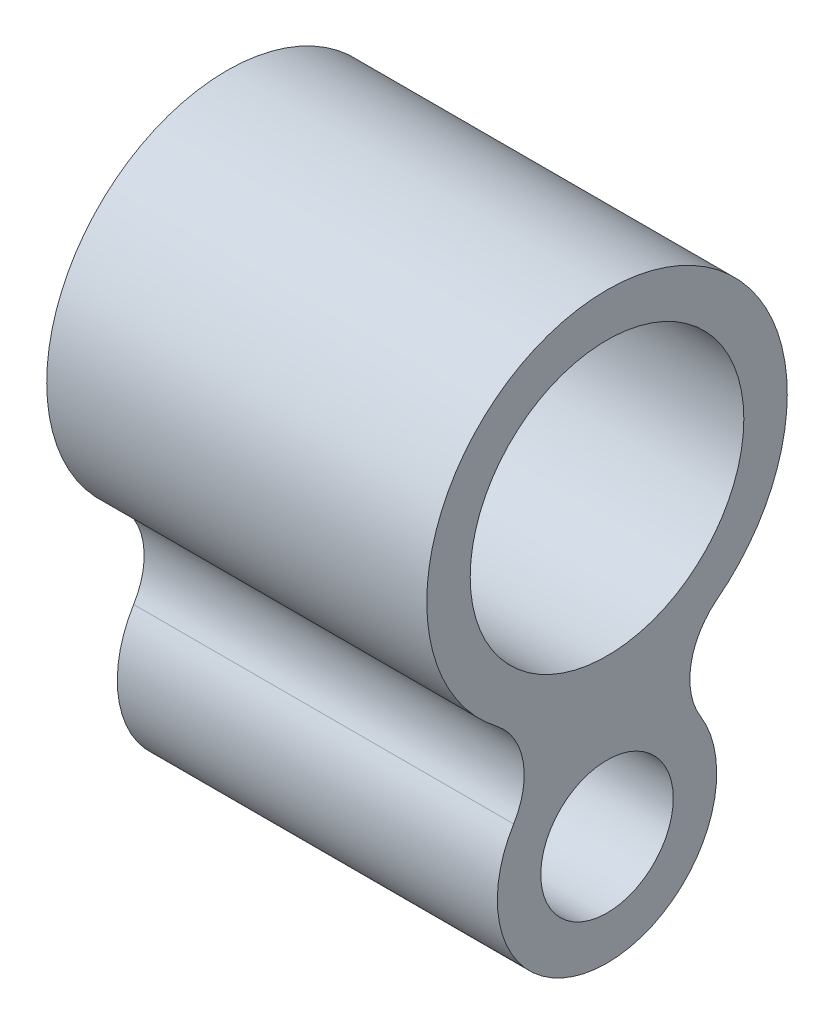
ISO-10303-21;
HEADER;
FILE_DESCRIPTION(('STEP AP214'),'2;1');
FILE_NAME('part.step','',(''),(''),'','','');
FILE_SCHEMA(('AUTOMOTIVE_DESIGN { 1 0 10303 214 1 1 1 1 }'));
ENDSEC;
DATA;
#1=APPLICATION_CONTEXT('core data for automotive mechanical design processes');
#2=APPLICATION_PROTOCOL_DEFINITION('international standard','automotive_design',2000,#1);
#3=PRODUCT_CONTEXT('',#1,'mechanical');
#4=PRODUCT('Part','Part','',(#3));
#5=PRODUCT_RELATED_PRODUCT_CATEGORY('part','',(#4));
#6=PRODUCT_DEFINITION_FORMATION('','',#4);
#7=PRODUCT_DEFINITION_CONTEXT('part definition',#1,'design');
#8=PRODUCT_DEFINITION('design','',#6,#7);
#9=PRODUCT_DEFINITION_SHAPE('','',#8);
#10=(LENGTH_UNIT() NAMED_UNIT(*) SI_UNIT(.MILLI.,.METRE.));
#11=(NAMED_UNIT(*) PLANE_ANGLE_UNIT() SI_UNIT($,.RADIAN.));
#12=(NAMED_UNIT(*) SI_UNIT($,.STERADIAN.) SOLID_ANGLE_UNIT());
#13=UNCERTAINTY_MEASURE_WITH_UNIT(LENGTH_MEASURE(1.E-05),#10,'distance_accuracy_value','');
#14=(GEOMETRIC_REPRESENTATION_CONTEXT(3) GLOBAL_UNCERTAINTY_ASSIGNED_CONTEXT((#13)) GLOBAL_UNIT_ASSIGNED_CONTEXT((#10,
#11,#12)) REPRESENTATION_CONTEXT('',''));
#15=CARTESIAN_POINT('',(0.,0.,0.));
#16=DIRECTION('',(0.,0.,1.));
#17=DIRECTION('',(1.,0.,0.));
#18=AXIS2_PLACEMENT_3D('',#15,#16,#17);
#19=CARTESIAN_POINT('',(35.,-27.,0.));
#20=DIRECTION('',(1.,0.,0.));
#21=DIRECTION('',(0.,0.,-1.));
#22=AXIS2_PLACEMENT_3D('',#19,#20,#21);
#23=PLANE('',#22);
#24=CARTESIAN_POINT('',(35.,-27.,0.));
#25=DIRECTION('',(1.,0.,0.));
#26=DIRECTION('',(0.,0.,-1.));
#27=AXIS2_PLACEMENT_3D('',#24,#25,#26);
#28=CIRCLE('',#27,10.1);
#29=CARTESIAN_POINT('',(35.,-21.6967725213764,8.59568370229917));
#30=VERTEX_POINT('',#29);
#31=CARTESIAN_POINT('',(35.,-21.6967725213764,-8.59568370229918));
#32=VERTEX_POINT('',#31);
#33=EDGE_CURVE('E138',#30,#32,#28,.T.);
#34=ORIENTED_EDGE('',*,*,#33,.T.);
#35=CARTESIAN_POINT('',(35.,-18.2803071393056,-14.1332277587267));
#36=DIRECTION('',(1.,0.,0.));
#37=DIRECTION('',(0.,0.,-1.));
#38=AXIS2_PLACEMENT_3D('',#35,#36,#37);
#39=CIRCLE('',#38,6.50666042480805);
#40=CARTESIAN_POINT('',(35.,-13.1744571875346,-10.1));
#41=VERTEX_POINT('',#40);
#42=EDGE_CURVE('E112',#41,#32,#39,.T.);
#43=ORIENTED_EDGE('',*,*,#42,.F.);
#44=DIRECTION('',(0.,1.,0.));
#45=VECTOR('',#44,1.);
#46=CARTESIAN_POINT('',(35.,-27.,-10.1));
#47=LINE('',#46,#45);
#48=CARTESIAN_POINT('',(35.,-13.1738377096425,-10.1));
#49=VERTEX_POINT('',#48);
#50=EDGE_CURVE('E137',#41,#49,#47,.T.);
#51=ORIENTED_EDGE('',*,*,#50,.T.);
#52=CARTESIAN_POINT('',(35.,0.,0.));
#53=DIRECTION('',(1.,0.,0.));
#54=DIRECTION('',(0.,0.,-1.));
#55=AXIS2_PLACEMENT_3D('',#52,#53,#54);
#56=CIRCLE('',#55,16.6);
#57=CARTESIAN_POINT('',(35.,-13.1738377096425,10.1));
#58=VERTEX_POINT('',#57);
#59=EDGE_CURVE('E39',#49,#58,#56,.T.);
#60=ORIENTED_EDGE('',*,*,#59,.T.);
#61=DIRECTION('',(0.,-1.,0.));
#62=VECTOR('',#61,1.);
#63=CARTESIAN_POINT('',(35.,-27.,10.1));
#64=LINE('',#63,#62);
#65=CARTESIAN_POINT('',(35.,-13.1744571875346,10.1));
#66=VERTEX_POINT('',#65);
#67=EDGE_CURVE('E141',#58,#66,#64,.T.);
#68=ORIENTED_EDGE('',*,*,#67,.T.);
#69=CARTESIAN_POINT('',(35.,-18.2803071393056,14.1332277587267));
#70=DIRECTION('',(1.,0.,0.));
#71=DIRECTION('',(0.,0.,-1.));
#72=AXIS2_PLACEMENT_3D('',#69,#70,#71);
#73=CIRCLE('',#72,6.50666042480806);
#74=EDGE_CURVE('E74',#30,#66,#73,.T.);
#75=ORIENTED_EDGE('',*,*,#74,.F.);
#76=EDGE_LOOP('',(#34,#43,#51,#60,#68,#75));
#77=FACE_BOUND('',#76,.T.);
#78=CARTESIAN_POINT('',(35.,0.,0.));
#79=DIRECTION('',(1.,0.,0.));
#80=DIRECTION('',(0.,0.,-1.));
#81=AXIS2_PLACEMENT_3D('',#78,#79,#80);
#82=CIRCLE('',#81,12.6);
#83=CARTESIAN_POINT('',(35.,0.,-12.6));
#84=VERTEX_POINT('',#83);
#85=EDGE_CURVE('E105',#84,#84,#82,.T.);
#86=ORIENTED_EDGE('',*,*,#85,.F.);
#87=EDGE_LOOP('',(#86));
#88=FACE_BOUND('',#87,.T.);
#89=CARTESIAN_POINT('',(35.,-27.,0.));
#90=DIRECTION('',(1.,0.,0.));
#91=DIRECTION('',(0.,0.,-1.));
#92=AXIS2_PLACEMENT_3D('',#89,#90,#91);
#93=CIRCLE('',#92,6.1);
#94=CARTESIAN_POINT('',(35.,-27.,-6.1));
#95=VERTEX_POINT('',#94);
#96=EDGE_CURVE('E127',#95,#95,#93,.T.);
#97=ORIENTED_EDGE('',*,*,#96,.F.);
#98=EDGE_LOOP('',(#97));
#99=FACE_BOUND('',#98,.T.);
#100=ADVANCED_FACE('F35',(#77,#88,#99),#23,.T.);
#101=CARTESIAN_POINT('',(0.,-27.,0.));
#102=DIRECTION('',(1.,0.,0.));
#103=DIRECTION('',(0.,0.,-1.));
#104=AXIS2_PLACEMENT_3D('',#101,#102,#103);
#105=PLANE('',#104);
#106=CARTESIAN_POINT('',(0.,-18.2803071393056,-14.1332277587267));
#107=DIRECTION('',(1.,0.,0.));
#108=DIRECTION('',(0.,0.,1.));
#109=AXIS2_PLACEMENT_3D('',#106,#107,#108);
#110=CIRCLE('',#109,6.50666042480805);
#111=CARTESIAN_POINT('',(0.,-13.1744571875346,-10.1));
#112=VERTEX_POINT('',#111);
#113=CARTESIAN_POINT('',(0.,-21.6967725213764,-8.59568370229918));
#114=VERTEX_POINT('',#113);
#115=EDGE_CURVE('E110',#112,#114,#110,.T.);
#116=ORIENTED_EDGE('',*,*,#115,.T.);
#117=CARTESIAN_POINT('',(0.,-27.,0.));
#118=DIRECTION('',(1.,0.,0.));
#119=DIRECTION('',(0.,0.,-1.));
#120=AXIS2_PLACEMENT_3D('',#117,#118,#119);
#121=CIRCLE('',#120,10.1);
#122=CARTESIAN_POINT('',(0.,-21.6967725213764,8.59568370229917));
#123=VERTEX_POINT('',#122);
#124=EDGE_CURVE('E97',#123,#114,#121,.T.);
#125=ORIENTED_EDGE('',*,*,#124,.F.);
#126=CARTESIAN_POINT('',(0.,-18.2803071393056,14.1332277587267));
#127=DIRECTION('',(1.,0.,0.));
#128=DIRECTION('',(0.,0.,-1.));
#129=AXIS2_PLACEMENT_3D('',#126,#127,#128);
#130=CIRCLE('',#129,6.50666042480806);
#131=CARTESIAN_POINT('',(0.,-13.1744571875346,10.1));
#132=VERTEX_POINT('',#131);
#133=EDGE_CURVE('E122',#123,#132,#130,.T.);
#134=ORIENTED_EDGE('',*,*,#133,.T.);
#135=DIRECTION('',(0.,-1.,0.));
#136=VECTOR('',#135,1.);
#137=CARTESIAN_POINT('',(0.,-27.,10.1));
#138=LINE('',#137,#136);
#139=CARTESIAN_POINT('',(0.,-13.1738377096425,10.1));
#140=VERTEX_POINT('',#139);
#141=EDGE_CURVE('E147',#140,#132,#138,.T.);
#142=ORIENTED_EDGE('',*,*,#141,.F.);
#143=CARTESIAN_POINT('',(0.,0.,0.));
#144=DIRECTION('',(1.,0.,0.));
#145=DIRECTION('',(0.,0.,-1.));
#146=AXIS2_PLACEMENT_3D('',#143,#144,#145);
#147=CIRCLE('',#146,16.6);
#148=CARTESIAN_POINT('',(0.,-13.1738377096425,-10.1));
#149=VERTEX_POINT('',#148);
#150=EDGE_CURVE('E145',#149,#140,#147,.T.);
#151=ORIENTED_EDGE('',*,*,#150,.F.);
#152=DIRECTION('',(0.,1.,0.));
#153=VECTOR('',#152,1.);
#154=CARTESIAN_POINT('',(0.,-27.,-10.1));
#155=LINE('',#154,#153);
#156=EDGE_CURVE('E65',#112,#149,#155,.T.);
#157=ORIENTED_EDGE('',*,*,#156,.F.);
#158=EDGE_LOOP('',(#116,#125,#134,#142,#151,#157));
#159=FACE_BOUND('',#158,.T.);
#160=CARTESIAN_POINT('',(0.,0.,0.));
#161=DIRECTION('',(1.,0.,0.));
#162=DIRECTION('',(0.,0.,-1.));
#163=AXIS2_PLACEMENT_3D('',#160,#161,#162);
#164=CIRCLE('',#163,12.6);
#165=CARTESIAN_POINT('',(0.,0.,-12.6));
#166=VERTEX_POINT('',#165);
#167=EDGE_CURVE('E130',#166,#166,#164,.T.);
#168=ORIENTED_EDGE('',*,*,#167,.T.);
#169=EDGE_LOOP('',(#168));
#170=FACE_BOUND('',#169,.T.);
#171=CARTESIAN_POINT('',(0.,-27.,0.));
#172=DIRECTION('',(1.,0.,0.));
#173=DIRECTION('',(0.,0.,-1.));
#174=AXIS2_PLACEMENT_3D('',#171,#172,#173);
#175=CIRCLE('',#174,6.1);
#176=CARTESIAN_POINT('',(0.,-27.,-6.1));
#177=VERTEX_POINT('',#176);
#178=EDGE_CURVE('E126',#177,#177,#175,.T.);
#179=ORIENTED_EDGE('',*,*,#178,.T.);
#180=EDGE_LOOP('',(#179));
#181=FACE_BOUND('',#180,.T.);
#182=ADVANCED_FACE('F115',(#159,#170,#181),#105,.F.);
#183=CARTESIAN_POINT('',(35.,-27.,0.));
#184=DIRECTION('',(-1.,0.,0.));
#185=DIRECTION('',(0.,0.,1.));
#186=AXIS2_PLACEMENT_3D('',#183,#184,#185);
#187=CYLINDRICAL_SURFACE('',#186,10.1);
#188=ORIENTED_EDGE('',*,*,#124,.T.);
#189=DIRECTION('',(1.,0.,0.));
#190=VECTOR('',#189,1.);
#191=CARTESIAN_POINT('',(0.,-21.6967725213764,-8.59568370229918));
#192=LINE('',#191,#190);
#193=EDGE_CURVE('E99',#114,#32,#192,.T.);
#194=ORIENTED_EDGE('',*,*,#193,.T.);
#195=ORIENTED_EDGE('',*,*,#33,.F.);
#196=DIRECTION('',(1.,0.,0.));
#197=VECTOR('',#196,1.);
#198=CARTESIAN_POINT('',(0.,-21.6967725213764,8.59568370229917));
#199=LINE('',#198,#197);
#200=EDGE_CURVE('E100',#123,#30,#199,.T.);
#201=ORIENTED_EDGE('',*,*,#200,.F.);
#202=EDGE_LOOP('',(#188,#194,#195,#201));
#203=FACE_BOUND('',#202,.T.);
#204=ADVANCED_FACE('F37',(#203),#187,.T.);
#205=CARTESIAN_POINT('',(35.,-27.,-10.1));
#206=DIRECTION('',(0.,0.,1.));
#207=DIRECTION('',(0.,-1.,0.));
#208=AXIS2_PLACEMENT_3D('',#205,#206,#207);
#209=PLANE('',#208);
#210=ORIENTED_EDGE('',*,*,#50,.F.);
#211=DIRECTION('',(1.,0.,0.));
#212=VECTOR('',#211,1.);
#213=CARTESIAN_POINT('',(0.,-13.1744571875346,-10.1));
#214=LINE('',#213,#212);
#215=EDGE_CURVE('E113',#41,#112,#214,.F.);
#216=ORIENTED_EDGE('',*,*,#215,.T.);
#217=ORIENTED_EDGE('',*,*,#156,.T.);
#218=DIRECTION('',(-1.,0.,0.));
#219=VECTOR('',#218,1.);
#220=CARTESIAN_POINT('',(35.,-13.1738377096425,-10.1));
#221=LINE('',#220,#219);
#222=EDGE_CURVE('E46',#49,#149,#221,.T.);
#223=ORIENTED_EDGE('',*,*,#222,.F.);
#224=EDGE_LOOP('',(#210,#216,#217,#223));
#225=FACE_BOUND('',#224,.T.);
#226=ADVANCED_FACE('F163',(#225),#209,.F.);
#227=CARTESIAN_POINT('',(35.,0.,0.));
#228=DIRECTION('',(-1.,0.,0.));
#229=DIRECTION('',(0.,0.,1.));
#230=AXIS2_PLACEMENT_3D('',#227,#228,#229);
#231=CYLINDRICAL_SURFACE('',#230,16.6);
#232=ORIENTED_EDGE('',*,*,#150,.T.);
#233=DIRECTION('',(-1.,0.,0.));
#234=VECTOR('',#233,1.);
#235=CARTESIAN_POINT('',(35.,-13.1738377096425,10.1));
#236=LINE('',#235,#234);
#237=EDGE_CURVE('E142',#58,#140,#236,.T.);
#238=ORIENTED_EDGE('',*,*,#237,.F.);
#239=ORIENTED_EDGE('',*,*,#59,.F.);
#240=ORIENTED_EDGE('',*,*,#222,.T.);
#241=EDGE_LOOP('',(#232,#238,#239,#240));
#242=FACE_BOUND('',#241,.T.);
#243=ADVANCED_FACE('F162',(#242),#231,.T.);
#244=CARTESIAN_POINT('',(35.,-27.,10.1));
#245=DIRECTION('',(0.,0.,-1.));
#246=DIRECTION('',(0.,1.,0.));
#247=AXIS2_PLACEMENT_3D('',#244,#245,#246);
#248=PLANE('',#247);
#249=ORIENTED_EDGE('',*,*,#141,.T.);
#250=DIRECTION('',(1.,0.,0.));
#251=VECTOR('',#250,1.);
#252=CARTESIAN_POINT('',(0.,-13.1744571875346,10.1));
#253=LINE('',#252,#251);
#254=EDGE_CURVE('E11',#132,#66,#253,.T.);
#255=ORIENTED_EDGE('',*,*,#254,.T.);
#256=ORIENTED_EDGE('',*,*,#67,.F.);
#257=ORIENTED_EDGE('',*,*,#237,.T.);
#258=EDGE_LOOP('',(#249,#255,#256,#257));
#259=FACE_BOUND('',#258,.T.);
#260=ADVANCED_FACE('F159',(#259),#248,.F.);
#261=CARTESIAN_POINT('',(35.,0.,0.));
#262=DIRECTION('',(-1.,0.,0.));
#263=DIRECTION('',(0.,0.,1.));
#264=AXIS2_PLACEMENT_3D('',#261,#262,#263);
#265=CYLINDRICAL_SURFACE('',#264,12.6);
#266=ORIENTED_EDGE('',*,*,#85,.T.);
#267=EDGE_LOOP('',(#266));
#268=FACE_BOUND('',#267,.T.);
#269=ORIENTED_EDGE('',*,*,#167,.F.);
#270=EDGE_LOOP('',(#269));
#271=FACE_BOUND('',#270,.T.);
#272=ADVANCED_FACE('F177',(#268,#271),#265,.F.);
#273=CARTESIAN_POINT('',(35.,-27.,0.));
#274=DIRECTION('',(-1.,0.,0.));
#275=DIRECTION('',(0.,0.,1.));
#276=AXIS2_PLACEMENT_3D('',#273,#274,#275);
#277=CYLINDRICAL_SURFACE('',#276,6.1);
#278=ORIENTED_EDGE('',*,*,#96,.T.);
#279=EDGE_LOOP('',(#278));
#280=FACE_BOUND('',#279,.T.);
#281=ORIENTED_EDGE('',*,*,#178,.F.);
#282=EDGE_LOOP('',(#281));
#283=FACE_BOUND('',#282,.T.);
#284=ADVANCED_FACE('F184',(#280,#283),#277,.F.);
#285=CARTESIAN_POINT('',(0.,-18.2803071393056,14.1332277587267));
#286=DIRECTION('',(1.,0.,0.));
#287=DIRECTION('',(0.,0.,-1.));
#288=AXIS2_PLACEMENT_3D('',#285,#286,#287);
#289=CYLINDRICAL_SURFACE('',#288,6.50666042480806);
#290=ORIENTED_EDGE('',*,*,#74,.T.);
#291=ORIENTED_EDGE('',*,*,#254,.F.);
#292=ORIENTED_EDGE('',*,*,#133,.F.);
#293=ORIENTED_EDGE('',*,*,#200,.T.);
#294=EDGE_LOOP('',(#290,#291,#292,#293));
#295=FACE_BOUND('',#294,.T.);
#296=ADVANCED_FACE('F156',(#295),#289,.F.);
#297=CARTESIAN_POINT('',(0.,-18.2803071393056,-14.1332277587267));
#298=DIRECTION('',(1.,0.,0.));
#299=DIRECTION('',(0.,0.,-1.));
#300=AXIS2_PLACEMENT_3D('',#297,#298,#299);
#301=CYLINDRICAL_SURFACE('',#300,6.50666042480805);
#302=ORIENTED_EDGE('',*,*,#42,.T.);
#303=ORIENTED_EDGE('',*,*,#193,.F.);
#304=ORIENTED_EDGE('',*,*,#115,.F.);
#305=ORIENTED_EDGE('',*,*,#215,.F.);
#306=EDGE_LOOP('',(#302,#303,#304,#305));
#307=FACE_BOUND('',#306,.T.);
#308=ADVANCED_FACE('F109',(#307),#301,.F.);
#309=CLOSED_SHELL('',(#100,#182,#204,#226,#243,#260,#272,#284,#296,#308));
#310=MANIFOLD_SOLID_BREP('B2',#309);
#311=ADVANCED_BREP_SHAPE_REPRESENTATION('',(#18,#310),#14);
#312=SHAPE_DEFINITION_REPRESENTATION(#9,#311);
ENDSEC;
END-ISO-10303-21;
